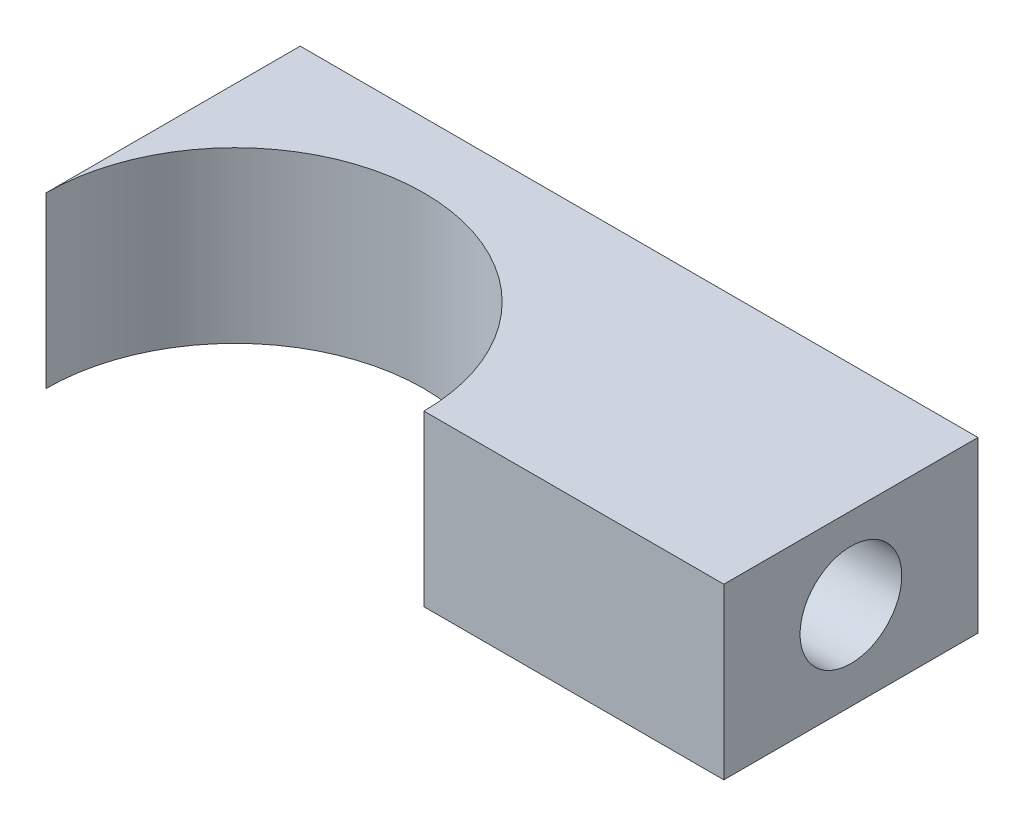
ISO-10303-21;
HEADER;
FILE_DESCRIPTION(('STEP AP214'),'2;1');
FILE_NAME('part.step','',(''),(''),'','','');
FILE_SCHEMA(('AUTOMOTIVE_DESIGN { 1 0 10303 214 1 1 1 1 }'));
ENDSEC;
DATA;
#1=APPLICATION_CONTEXT('core data for automotive mechanical design processes');
#2=APPLICATION_PROTOCOL_DEFINITION('international standard','automotive_design',2000,#1);
#3=PRODUCT_CONTEXT('',#1,'mechanical');
#4=PRODUCT('Part','Part','',(#3));
#5=PRODUCT_RELATED_PRODUCT_CATEGORY('part','',(#4));
#6=PRODUCT_DEFINITION_FORMATION('','',#4);
#7=PRODUCT_DEFINITION_CONTEXT('part definition',#1,'design');
#8=PRODUCT_DEFINITION('design','',#6,#7);
#9=PRODUCT_DEFINITION_SHAPE('','',#8);
#10=(LENGTH_UNIT() NAMED_UNIT(*) SI_UNIT(.MILLI.,.METRE.));
#11=(NAMED_UNIT(*) PLANE_ANGLE_UNIT() SI_UNIT($,.RADIAN.));
#12=(NAMED_UNIT(*) SI_UNIT($,.STERADIAN.) SOLID_ANGLE_UNIT());
#13=UNCERTAINTY_MEASURE_WITH_UNIT(LENGTH_MEASURE(1.E-05),#10,'distance_accuracy_value','');
#14=(GEOMETRIC_REPRESENTATION_CONTEXT(3) GLOBAL_UNCERTAINTY_ASSIGNED_CONTEXT((#13)) GLOBAL_UNIT_ASSIGNED_CONTEXT((#10,
#11,#12)) REPRESENTATION_CONTEXT('',''));
#15=CARTESIAN_POINT('',(0.,0.,0.));
#16=DIRECTION('',(0.,0.,1.));
#17=DIRECTION('',(1.,0.,0.));
#18=AXIS2_PLACEMENT_3D('',#15,#16,#17);
#19=CARTESIAN_POINT('',(-20.,10.,7.5));
#20=DIRECTION('',(1.,0.,0.));
#21=DIRECTION('',(0.,0.,-1.));
#22=AXIS2_PLACEMENT_3D('',#19,#20,#21);
#23=PLANE('',#22);
#24=DIRECTION('',(0.,0.,1.));
#25=VECTOR('',#24,1.);
#26=CARTESIAN_POINT('',(-20.,0.,7.5));
#27=LINE('',#26,#25);
#28=CARTESIAN_POINT('',(-20.,0.,-7.5));
#29=VERTEX_POINT('',#28);
#30=CARTESIAN_POINT('',(-20.,0.,7.5));
#31=VERTEX_POINT('',#30);
#32=EDGE_CURVE('E105',#29,#31,#27,.T.);
#33=ORIENTED_EDGE('',*,*,#32,.T.);
#34=DIRECTION('',(0.,-1.,0.));
#35=VECTOR('',#34,1.);
#36=CARTESIAN_POINT('',(-20.,10.,7.5));
#37=LINE('',#36,#35);
#38=CARTESIAN_POINT('',(-20.,10.,7.5));
#39=VERTEX_POINT('',#38);
#40=EDGE_CURVE('E11',#39,#31,#37,.T.);
#41=ORIENTED_EDGE('',*,*,#40,.F.);
#42=DIRECTION('',(0.,0.,1.));
#43=VECTOR('',#42,1.);
#44=CARTESIAN_POINT('',(-20.,10.,7.5));
#45=LINE('',#44,#43);
#46=CARTESIAN_POINT('',(-20.,10.,-7.5));
#47=VERTEX_POINT('',#46);
#48=EDGE_CURVE('E113',#47,#39,#45,.T.);
#49=ORIENTED_EDGE('',*,*,#48,.F.);
#50=DIRECTION('',(0.,-1.,0.));
#51=VECTOR('',#50,1.);
#52=CARTESIAN_POINT('',(-20.,10.,-7.5));
#53=LINE('',#52,#51);
#54=EDGE_CURVE('E114',#47,#29,#53,.T.);
#55=ORIENTED_EDGE('',*,*,#54,.T.);
#56=EDGE_LOOP('',(#33,#41,#49,#55));
#57=FACE_BOUND('',#56,.T.);
#58=ADVANCED_FACE('F33',(#57),#23,.F.);
#59=CARTESIAN_POINT('',(-20.,10.,7.5));
#60=DIRECTION('',(0.,0.,-1.));
#61=DIRECTION('',(-1.,0.,0.));
#62=AXIS2_PLACEMENT_3D('',#59,#60,#61);
#63=PLANE('',#62);
#64=DIRECTION('',(1.,0.,0.));
#65=VECTOR('',#64,1.);
#66=CARTESIAN_POINT('',(-20.,10.,7.5));
#67=LINE('',#66,#65);
#68=CARTESIAN_POINT('',(2.3,10.,7.5));
#69=VERTEX_POINT('',#68);
#70=CARTESIAN_POINT('',(20.,10.,7.5));
#71=VERTEX_POINT('',#70);
#72=EDGE_CURVE('E76',#69,#71,#67,.T.);
#73=ORIENTED_EDGE('',*,*,#72,.F.);
#74=DIRECTION('',(0.,1.,0.));
#75=VECTOR('',#74,1.);
#76=CARTESIAN_POINT('',(2.3,0.,7.5));
#77=LINE('',#76,#75);
#78=CARTESIAN_POINT('',(2.3,0.,7.5));
#79=VERTEX_POINT('',#78);
#80=EDGE_CURVE('E91',#69,#79,#77,.F.);
#81=ORIENTED_EDGE('',*,*,#80,.T.);
#82=DIRECTION('',(1.,0.,0.));
#83=VECTOR('',#82,1.);
#84=CARTESIAN_POINT('',(-20.,0.,7.5));
#85=LINE('',#84,#83);
#86=CARTESIAN_POINT('',(20.,0.,7.5));
#87=VERTEX_POINT('',#86);
#88=EDGE_CURVE('E101',#79,#87,#85,.T.);
#89=ORIENTED_EDGE('',*,*,#88,.T.);
#90=DIRECTION('',(0.,-1.,0.));
#91=VECTOR('',#90,1.);
#92=CARTESIAN_POINT('',(20.,10.,7.5));
#93=LINE('',#92,#91);
#94=EDGE_CURVE('E41',#71,#87,#93,.T.);
#95=ORIENTED_EDGE('',*,*,#94,.F.);
#96=EDGE_LOOP('',(#73,#81,#89,#95));
#97=FACE_BOUND('',#96,.T.);
#98=ADVANCED_FACE('F100',(#97),#63,.F.);
#99=CARTESIAN_POINT('',(20.,10.,7.5));
#100=DIRECTION('',(-1.,0.,0.));
#101=DIRECTION('',(0.,0.,1.));
#102=AXIS2_PLACEMENT_3D('',#99,#100,#101);
#103=PLANE('',#102);
#104=CARTESIAN_POINT('',(20.,5.1931639711893,0.));
#105=DIRECTION('',(1.,0.,0.));
#106=DIRECTION('',(0.,0.,-1.));
#107=AXIS2_PLACEMENT_3D('',#104,#105,#106);
#108=CIRCLE('',#107,3.);
#109=CARTESIAN_POINT('',(20.,5.1931639711893,-3.));
#110=VERTEX_POINT('',#109);
#111=EDGE_CURVE('E102',#110,#110,#108,.T.);
#112=ORIENTED_EDGE('',*,*,#111,.F.);
#113=EDGE_LOOP('',(#112));
#114=FACE_BOUND('',#113,.T.);
#115=DIRECTION('',(0.,0.,-1.));
#116=VECTOR('',#115,1.);
#117=CARTESIAN_POINT('',(20.,0.,7.5));
#118=LINE('',#117,#116);
#119=CARTESIAN_POINT('',(20.,0.,-7.5));
#120=VERTEX_POINT('',#119);
#121=EDGE_CURVE('E66',#87,#120,#118,.T.);
#122=ORIENTED_EDGE('',*,*,#121,.T.);
#123=DIRECTION('',(0.,-1.,0.));
#124=VECTOR('',#123,1.);
#125=CARTESIAN_POINT('',(20.,10.,-7.5));
#126=LINE('',#125,#124);
#127=CARTESIAN_POINT('',(20.,10.,-7.5));
#128=VERTEX_POINT('',#127);
#129=EDGE_CURVE('E116',#128,#120,#126,.T.);
#130=ORIENTED_EDGE('',*,*,#129,.F.);
#131=DIRECTION('',(0.,0.,-1.));
#132=VECTOR('',#131,1.);
#133=CARTESIAN_POINT('',(20.,10.,7.5));
#134=LINE('',#133,#132);
#135=EDGE_CURVE('E119',#71,#128,#134,.T.);
#136=ORIENTED_EDGE('',*,*,#135,.F.);
#137=ORIENTED_EDGE('',*,*,#94,.T.);
#138=EDGE_LOOP('',(#122,#130,#136,#137));
#139=FACE_BOUND('',#138,.T.);
#140=ADVANCED_FACE('F118',(#114,#139),#103,.F.);
#141=CARTESIAN_POINT('',(-20.,10.,-7.5));
#142=DIRECTION('',(0.,0.,1.));
#143=DIRECTION('',(1.,0.,0.));
#144=AXIS2_PLACEMENT_3D('',#141,#142,#143);
#145=PLANE('',#144);
#146=DIRECTION('',(-1.,0.,0.));
#147=VECTOR('',#146,1.);
#148=CARTESIAN_POINT('',(-20.,0.,-7.5));
#149=LINE('',#148,#147);
#150=EDGE_CURVE('E71',#120,#29,#149,.T.);
#151=ORIENTED_EDGE('',*,*,#150,.T.);
#152=ORIENTED_EDGE('',*,*,#54,.F.);
#153=DIRECTION('',(-1.,0.,0.));
#154=VECTOR('',#153,1.);
#155=CARTESIAN_POINT('',(-20.,10.,-7.5));
#156=LINE('',#155,#154);
#157=EDGE_CURVE('E49',#128,#47,#156,.T.);
#158=ORIENTED_EDGE('',*,*,#157,.F.);
#159=ORIENTED_EDGE('',*,*,#129,.T.);
#160=EDGE_LOOP('',(#151,#152,#158,#159));
#161=FACE_BOUND('',#160,.T.);
#162=ADVANCED_FACE('F131',(#161),#145,.F.);
#163=CARTESIAN_POINT('',(0.,10.,0.));
#164=DIRECTION('',(0.,-1.,0.));
#165=DIRECTION('',(0.,0.,-1.));
#166=AXIS2_PLACEMENT_3D('',#163,#164,#165);
#167=PLANE('',#166);
#168=ORIENTED_EDGE('',*,*,#48,.T.);
#169=CARTESIAN_POINT('',(-8.85,10.,7.5));
#170=DIRECTION('',(0.,1.,0.));
#171=DIRECTION('',(0.,0.,1.));
#172=AXIS2_PLACEMENT_3D('',#169,#170,#171);
#173=CIRCLE('',#172,11.15);
#174=EDGE_CURVE('E97',#69,#39,#173,.T.);
#175=ORIENTED_EDGE('',*,*,#174,.F.);
#176=ORIENTED_EDGE('',*,*,#72,.T.);
#177=ORIENTED_EDGE('',*,*,#135,.T.);
#178=ORIENTED_EDGE('',*,*,#157,.T.);
#179=EDGE_LOOP('',(#168,#175,#176,#177,#178));
#180=FACE_BOUND('',#179,.T.);
#181=ADVANCED_FACE('F129',(#180),#167,.F.);
#182=CARTESIAN_POINT('',(0.,0.,0.));
#183=DIRECTION('',(0.,-1.,0.));
#184=DIRECTION('',(0.,0.,-1.));
#185=AXIS2_PLACEMENT_3D('',#182,#183,#184);
#186=PLANE('',#185);
#187=CARTESIAN_POINT('',(-8.85,0.,7.5));
#188=DIRECTION('',(0.,1.,0.));
#189=DIRECTION('',(0.,0.,1.));
#190=AXIS2_PLACEMENT_3D('',#187,#188,#189);
#191=CIRCLE('',#190,11.15);
#192=EDGE_CURVE('E88',#79,#31,#191,.T.);
#193=ORIENTED_EDGE('',*,*,#192,.T.);
#194=ORIENTED_EDGE('',*,*,#32,.F.);
#195=ORIENTED_EDGE('',*,*,#150,.F.);
#196=ORIENTED_EDGE('',*,*,#121,.F.);
#197=ORIENTED_EDGE('',*,*,#88,.F.);
#198=EDGE_LOOP('',(#193,#194,#195,#196,#197));
#199=FACE_BOUND('',#198,.T.);
#200=ADVANCED_FACE('F104',(#199),#186,.T.);
#201=CARTESIAN_POINT('',(10.,5.1931639711893,0.));
#202=DIRECTION('',(1.,0.,0.));
#203=DIRECTION('',(0.,0.,-1.));
#204=AXIS2_PLACEMENT_3D('',#201,#202,#203);
#205=CYLINDRICAL_SURFACE('',#204,3.);
#206=CARTESIAN_POINT('',(10.,5.1931639711893,0.));
#207=DIRECTION('',(1.,0.,0.));
#208=DIRECTION('',(0.,0.,-1.));
#209=AXIS2_PLACEMENT_3D('',#206,#207,#208);
#210=CIRCLE('',#209,3.);
#211=CARTESIAN_POINT('',(10.,5.1931639711893,-3.));
#212=VERTEX_POINT('',#211);
#213=EDGE_CURVE('E108',#212,#212,#210,.T.);
#214=ORIENTED_EDGE('',*,*,#213,.F.);
#215=EDGE_LOOP('',(#214));
#216=FACE_BOUND('',#215,.T.);
#217=ORIENTED_EDGE('',*,*,#111,.T.);
#218=EDGE_LOOP('',(#217));
#219=FACE_BOUND('',#218,.T.);
#220=ADVANCED_FACE('F160',(#216,#219),#205,.F.);
#221=CARTESIAN_POINT('',(10.,5.1931639711893,0.));
#222=DIRECTION('',(1.,0.,0.));
#223=DIRECTION('',(0.,0.,-1.));
#224=AXIS2_PLACEMENT_3D('',#221,#222,#223);
#225=PLANE('',#224);
#226=ORIENTED_EDGE('',*,*,#213,.T.);
#227=EDGE_LOOP('',(#226));
#228=FACE_BOUND('',#227,.T.);
#229=ADVANCED_FACE('F165',(#228),#225,.T.);
#230=CARTESIAN_POINT('',(-8.85,0.,7.5));
#231=DIRECTION('',(0.,1.,0.));
#232=DIRECTION('',(0.,0.,1.));
#233=AXIS2_PLACEMENT_3D('',#230,#231,#232);
#234=CYLINDRICAL_SURFACE('',#233,11.15);
#235=ORIENTED_EDGE('',*,*,#192,.F.);
#236=ORIENTED_EDGE('',*,*,#80,.F.);
#237=ORIENTED_EDGE('',*,*,#174,.T.);
#238=ORIENTED_EDGE('',*,*,#40,.T.);
#239=EDGE_LOOP('',(#235,#236,#237,#238));
#240=FACE_BOUND('',#239,.T.);
#241=ADVANCED_FACE('F90',(#240),#234,.F.);
#242=CLOSED_SHELL('',(#58,#98,#140,#162,#181,#200,#220,#229,#241));
#243=MANIFOLD_SOLID_BREP('B2',#242);
#244=ADVANCED_BREP_SHAPE_REPRESENTATION('',(#18,#243),#14);
#245=SHAPE_DEFINITION_REPRESENTATION(#9,#244);
ENDSEC;
END-ISO-10303-21;
